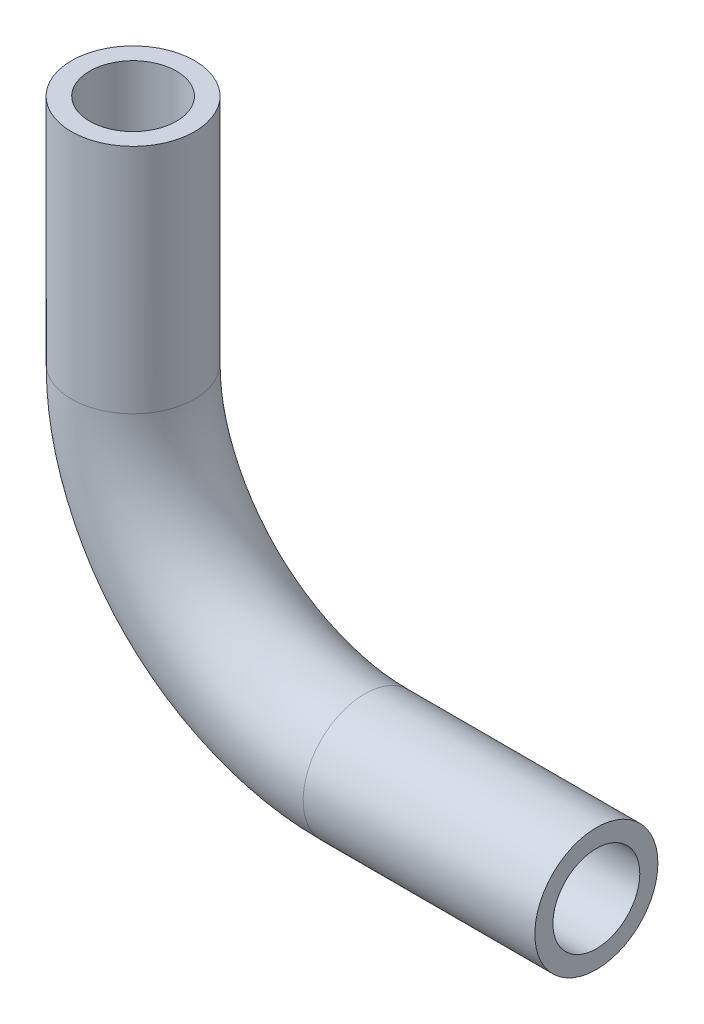
ISO-10303-21;
HEADER;
FILE_DESCRIPTION(('STEP AP214'),'2;1');
FILE_NAME('part.step','',(''),(''),'','','');
FILE_SCHEMA(('AUTOMOTIVE_DESIGN { 1 0 10303 214 1 1 1 1 }'));
ENDSEC;
DATA;
#1=APPLICATION_CONTEXT('core data for automotive mechanical design processes');
#2=APPLICATION_PROTOCOL_DEFINITION('international standard','automotive_design',2000,#1);
#3=PRODUCT_CONTEXT('',#1,'mechanical');
#4=PRODUCT('Part','Part','',(#3));
#5=PRODUCT_RELATED_PRODUCT_CATEGORY('part','',(#4));
#6=PRODUCT_DEFINITION_FORMATION('','',#4);
#7=PRODUCT_DEFINITION_CONTEXT('part definition',#1,'design');
#8=PRODUCT_DEFINITION('design','',#6,#7);
#9=PRODUCT_DEFINITION_SHAPE('','',#8);
#10=(LENGTH_UNIT() NAMED_UNIT(*) SI_UNIT(.MILLI.,.METRE.));
#11=(NAMED_UNIT(*) PLANE_ANGLE_UNIT() SI_UNIT($,.RADIAN.));
#12=(NAMED_UNIT(*) SI_UNIT($,.STERADIAN.) SOLID_ANGLE_UNIT());
#13=UNCERTAINTY_MEASURE_WITH_UNIT(LENGTH_MEASURE(1.E-05),#10,'distance_accuracy_value','');
#14=(GEOMETRIC_REPRESENTATION_CONTEXT(3) GLOBAL_UNCERTAINTY_ASSIGNED_CONTEXT((#13)) GLOBAL_UNIT_ASSIGNED_CONTEXT((#10,
#11,#12)) REPRESENTATION_CONTEXT('',''));
#15=CARTESIAN_POINT('',(0.,0.,0.));
#16=DIRECTION('',(0.,0.,1.));
#17=DIRECTION('',(1.,0.,0.));
#18=AXIS2_PLACEMENT_3D('',#15,#16,#17);
#19=CARTESIAN_POINT('',(50.8,-50.8,0.));
#20=DIRECTION('',(1.,0.,0.));
#21=DIRECTION('',(0.,0.,-1.));
#22=AXIS2_PLACEMENT_3D('',#19,#20,#21);
#23=PLANE('',#22);
#24=CARTESIAN_POINT('',(50.8,-50.8,0.));
#25=DIRECTION('',(1.,0.,0.));
#26=DIRECTION('',(0.,0.,-1.));
#27=AXIS2_PLACEMENT_3D('',#24,#25,#26);
#28=CIRCLE('',#27,9.525);
#29=CARTESIAN_POINT('',(50.8,-50.8,-9.525));
#30=VERTEX_POINT('',#29);
#31=EDGE_CURVE('E83',#30,#30,#28,.F.);
#32=ORIENTED_EDGE('',*,*,#31,.T.);
#33=EDGE_LOOP('',(#32));
#34=FACE_BOUND('',#33,.T.);
#35=CARTESIAN_POINT('',(50.8,-50.8,0.));
#36=DIRECTION('',(1.,0.,0.));
#37=DIRECTION('',(0.,0.,-1.));
#38=AXIS2_PLACEMENT_3D('',#35,#36,#37);
#39=CIRCLE('',#38,13.49375);
#40=CARTESIAN_POINT('',(50.8,-50.8,-13.49375));
#41=VERTEX_POINT('',#40);
#42=EDGE_CURVE('E74',#41,#41,#39,.T.);
#43=ORIENTED_EDGE('',*,*,#42,.T.);
#44=EDGE_LOOP('',(#43));
#45=FACE_BOUND('',#44,.T.);
#46=ADVANCED_FACE('F60',(#34,#45),#23,.T.);
#47=CARTESIAN_POINT('',(-50.8,50.8,0.));
#48=DIRECTION('',(0.,-1.,0.));
#49=DIRECTION('',(0.,0.,-1.));
#50=AXIS2_PLACEMENT_3D('',#47,#48,#49);
#51=PLANE('',#50);
#52=CARTESIAN_POINT('',(-50.8,50.8,0.));
#53=DIRECTION('',(0.,-1.,0.));
#54=DIRECTION('',(0.,0.,-1.));
#55=AXIS2_PLACEMENT_3D('',#52,#53,#54);
#56=CIRCLE('',#55,9.525);
#57=CARTESIAN_POINT('',(-50.8,50.8,-9.525));
#58=VERTEX_POINT('',#57);
#59=EDGE_CURVE('E79',#58,#58,#56,.F.);
#60=ORIENTED_EDGE('',*,*,#59,.F.);
#61=EDGE_LOOP('',(#60));
#62=FACE_BOUND('',#61,.T.);
#63=CARTESIAN_POINT('',(-50.8,50.8,0.));
#64=DIRECTION('',(0.,-1.,0.));
#65=DIRECTION('',(0.,0.,-1.));
#66=AXIS2_PLACEMENT_3D('',#63,#64,#65);
#67=CIRCLE('',#66,13.49375);
#68=CARTESIAN_POINT('',(-50.8,50.8,-13.49375));
#69=VERTEX_POINT('',#68);
#70=EDGE_CURVE('E11',#69,#69,#67,.T.);
#71=ORIENTED_EDGE('',*,*,#70,.F.);
#72=EDGE_LOOP('',(#71));
#73=FACE_BOUND('',#72,.T.);
#74=ADVANCED_FACE('F118',(#62,#73),#51,.F.);
#75=CARTESIAN_POINT('',(50.8,-50.8,0.));
#76=DIRECTION('',(-1.,0.,0.));
#77=DIRECTION('',(0.,0.,1.));
#78=AXIS2_PLACEMENT_3D('',#75,#76,#77);
#79=CYLINDRICAL_SURFACE('',#78,13.49375);
#80=CARTESIAN_POINT('',(0.,-50.8,0.));
#81=DIRECTION('',(1.,0.,0.));
#82=DIRECTION('',(0.,0.,-1.));
#83=AXIS2_PLACEMENT_3D('',#80,#81,#82);
#84=CIRCLE('',#83,13.49375);
#85=CARTESIAN_POINT('',(0.,-64.29375,0.));
#86=VERTEX_POINT('',#85);
#87=EDGE_CURVE('E70',#86,#86,#84,.T.);
#88=ORIENTED_EDGE('',*,*,#87,.T.);
#89=EDGE_LOOP('',(#88));
#90=FACE_BOUND('',#89,.T.);
#91=ORIENTED_EDGE('',*,*,#42,.F.);
#92=EDGE_LOOP('',(#91));
#93=FACE_BOUND('',#92,.T.);
#94=ADVANCED_FACE('F114',(#90,#93),#79,.T.);
#95=CARTESIAN_POINT('',(0.,0.,0.));
#96=DIRECTION('',(0.,0.,-1.));
#97=DIRECTION('',(-1.,0.,0.));
#98=AXIS2_PLACEMENT_3D('',#95,#96,#97);
#99=TOROIDAL_SURFACE('',#98,50.8,13.49375);
#100=CARTESIAN_POINT('',(-50.8,0.,0.));
#101=DIRECTION('',(0.,-1.,0.));
#102=DIRECTION('',(0.,0.,-1.));
#103=AXIS2_PLACEMENT_3D('',#100,#101,#102);
#104=CIRCLE('',#103,13.49375);
#105=CARTESIAN_POINT('',(-64.29375,0.,0.));
#106=VERTEX_POINT('',#105);
#107=EDGE_CURVE('E66',#106,#106,#104,.T.);
#108=CARTESIAN_POINT('',(0.,0.,0.));
#109=DIRECTION('',(0.,0.,-1.));
#110=DIRECTION('',(-1.,0.,0.));
#111=AXIS2_PLACEMENT_3D('',#108,#109,#110);
#112=CIRCLE('',#111,64.29375);
#113=EDGE_CURVE('',#86,#106,#112,.T.);
#114=ORIENTED_EDGE('',*,*,#87,.F.);
#115=ORIENTED_EDGE('',*,*,#107,.T.);
#116=ORIENTED_EDGE('',*,*,#113,.T.);
#117=ORIENTED_EDGE('',*,*,#113,.F.);
#118=EDGE_LOOP('',(#114,#116,#115,#117));
#119=FACE_BOUND('',#118,.T.);
#120=ADVANCED_FACE('F109',(#119),#99,.T.);
#121=CARTESIAN_POINT('',(-50.8,0.,0.));
#122=DIRECTION('',(0.,1.,0.));
#123=DIRECTION('',(0.,0.,1.));
#124=AXIS2_PLACEMENT_3D('',#121,#122,#123);
#125=CYLINDRICAL_SURFACE('',#124,13.49375);
#126=ORIENTED_EDGE('',*,*,#70,.T.);
#127=EDGE_LOOP('',(#126));
#128=FACE_BOUND('',#127,.T.);
#129=ORIENTED_EDGE('',*,*,#107,.F.);
#130=EDGE_LOOP('',(#129));
#131=FACE_BOUND('',#130,.T.);
#132=ADVANCED_FACE('F105',(#128,#131),#125,.T.);
#133=CARTESIAN_POINT('',(55.7999999999947,-50.8,0.));
#134=DIRECTION('',(-1.,0.,0.));
#135=DIRECTION('',(0.,0.,1.));
#136=AXIS2_PLACEMENT_3D('',#133,#134,#135);
#137=CYLINDRICAL_SURFACE('',#136,9.525);
#138=CARTESIAN_POINT('',(0.,-50.8,0.));
#139=DIRECTION('',(-1.,0.,0.));
#140=DIRECTION('',(0.,0.,1.));
#141=AXIS2_PLACEMENT_3D('',#138,#139,#140);
#142=CIRCLE('',#141,9.525);
#143=CARTESIAN_POINT('',(0.,-60.325,0.));
#144=VERTEX_POINT('',#143);
#145=EDGE_CURVE('E86',#144,#144,#142,.T.);
#146=ORIENTED_EDGE('',*,*,#145,.T.);
#147=EDGE_LOOP('',(#146));
#148=FACE_BOUND('',#147,.T.);
#149=ORIENTED_EDGE('',*,*,#31,.F.);
#150=EDGE_LOOP('',(#149));
#151=FACE_BOUND('',#150,.T.);
#152=ADVANCED_FACE('F99',(#148,#151),#137,.F.);
#153=CARTESIAN_POINT('',(0.,0.,0.));
#154=DIRECTION('',(0.,0.,-1.));
#155=DIRECTION('',(-1.,0.,0.));
#156=AXIS2_PLACEMENT_3D('',#153,#154,#155);
#157=TOROIDAL_SURFACE('',#156,50.8,9.525);
#158=CARTESIAN_POINT('',(-50.8,0.,0.));
#159=DIRECTION('',(0.,1.,0.));
#160=DIRECTION('',(0.,0.,1.));
#161=AXIS2_PLACEMENT_3D('',#158,#159,#160);
#162=CIRCLE('',#161,9.525);
#163=CARTESIAN_POINT('',(-60.325,0.,0.));
#164=VERTEX_POINT('',#163);
#165=EDGE_CURVE('E82',#164,#164,#162,.T.);
#166=CARTESIAN_POINT('',(0.,0.,0.));
#167=DIRECTION('',(0.,0.,-1.));
#168=DIRECTION('',(-1.,0.,0.));
#169=AXIS2_PLACEMENT_3D('',#166,#167,#168);
#170=CIRCLE('',#169,60.325);
#171=EDGE_CURVE('',#144,#164,#170,.T.);
#172=ORIENTED_EDGE('',*,*,#145,.F.);
#173=ORIENTED_EDGE('',*,*,#165,.T.);
#174=ORIENTED_EDGE('',*,*,#171,.T.);
#175=ORIENTED_EDGE('',*,*,#171,.F.);
#176=EDGE_LOOP('',(#172,#174,#173,#175));
#177=FACE_BOUND('',#176,.T.);
#178=ADVANCED_FACE('F92',(#177),#157,.F.);
#179=CARTESIAN_POINT('',(-50.8,0.,0.));
#180=DIRECTION('',(0.,1.,0.));
#181=DIRECTION('',(0.,0.,1.));
#182=AXIS2_PLACEMENT_3D('',#179,#180,#181);
#183=CYLINDRICAL_SURFACE('',#182,9.525);
#184=ORIENTED_EDGE('',*,*,#59,.T.);
#185=EDGE_LOOP('',(#184));
#186=FACE_BOUND('',#185,.T.);
#187=ORIENTED_EDGE('',*,*,#165,.F.);
#188=EDGE_LOOP('',(#187));
#189=FACE_BOUND('',#188,.T.);
#190=ADVANCED_FACE('F95',(#186,#189),#183,.F.);
#191=CLOSED_SHELL('',(#46,#74,#94,#120,#132,#152,#178,#190));
#192=MANIFOLD_SOLID_BREP('B2',#191);
#193=ADVANCED_BREP_SHAPE_REPRESENTATION('',(#18,#192),#14);
#194=SHAPE_DEFINITION_REPRESENTATION(#9,#193);
ENDSEC;
END-ISO-10303-21;
